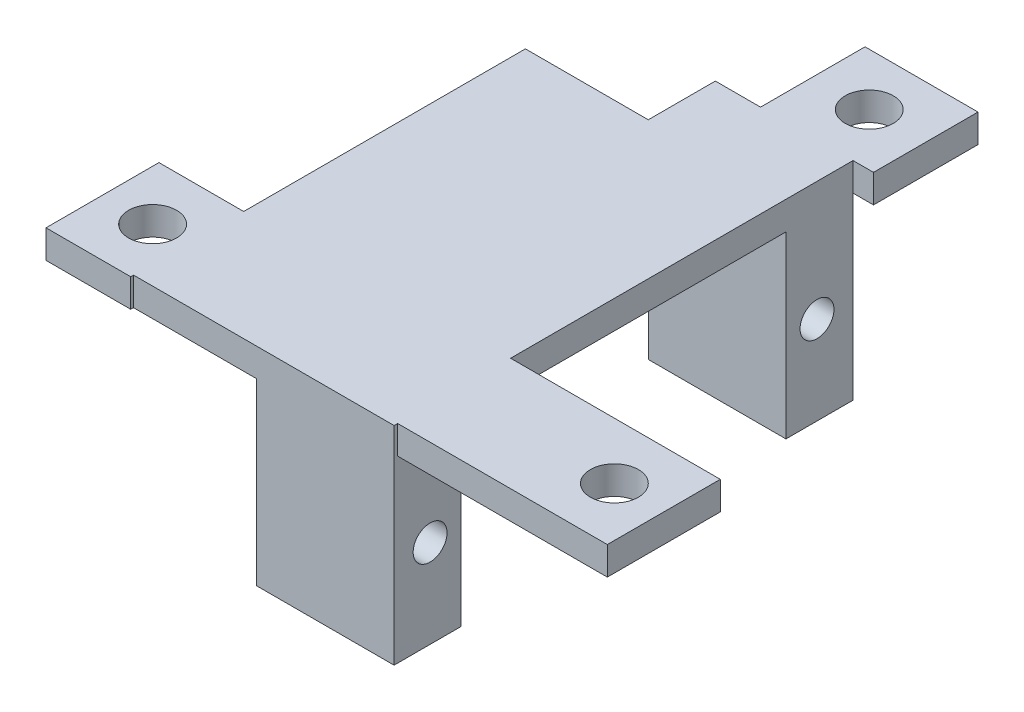
ISO-10303-21;
HEADER;
FILE_DESCRIPTION(('STEP AP214'),'2;1');
FILE_NAME('part.step','',(''),(''),'','','');
FILE_SCHEMA(('AUTOMOTIVE_DESIGN { 1 0 10303 214 1 1 1 1 }'));
ENDSEC;
DATA;
#1=APPLICATION_CONTEXT('core data for automotive mechanical design processes');
#2=APPLICATION_PROTOCOL_DEFINITION('international standard','automotive_design',2000,#1);
#3=PRODUCT_CONTEXT('',#1,'mechanical');
#4=PRODUCT('Part','Part','',(#3));
#5=PRODUCT_RELATED_PRODUCT_CATEGORY('part','',(#4));
#6=PRODUCT_DEFINITION_FORMATION('','',#4);
#7=PRODUCT_DEFINITION_CONTEXT('part definition',#1,'design');
#8=PRODUCT_DEFINITION('design','',#6,#7);
#9=PRODUCT_DEFINITION_SHAPE('','',#8);
#10=(LENGTH_UNIT() NAMED_UNIT(*) SI_UNIT(.MILLI.,.METRE.));
#11=(NAMED_UNIT(*) PLANE_ANGLE_UNIT() SI_UNIT($,.RADIAN.));
#12=(NAMED_UNIT(*) SI_UNIT($,.STERADIAN.) SOLID_ANGLE_UNIT());
#13=UNCERTAINTY_MEASURE_WITH_UNIT(LENGTH_MEASURE(1.E-05),#10,'distance_accuracy_value','');
#14=(GEOMETRIC_REPRESENTATION_CONTEXT(3) GLOBAL_UNCERTAINTY_ASSIGNED_CONTEXT((#13)) GLOBAL_UNIT_ASSIGNED_CONTEXT((#10,
#11,#12)) REPRESENTATION_CONTEXT('',''));
#15=CARTESIAN_POINT('',(0.,0.,0.));
#16=DIRECTION('',(0.,0.,1.));
#17=DIRECTION('',(1.,0.,0.));
#18=AXIS2_PLACEMENT_3D('',#15,#16,#17);
#19=CARTESIAN_POINT('',(0.,0.,0.));
#20=DIRECTION('',(0.,1.,0.));
#21=DIRECTION('',(0.,0.,1.));
#22=AXIS2_PLACEMENT_3D('',#19,#20,#21);
#23=PLANE('',#22);
#24=CARTESIAN_POINT('',(12.3,0.,12.));
#25=DIRECTION('',(0.,1.,0.));
#26=DIRECTION('',(0.,0.,1.));
#27=AXIS2_PLACEMENT_3D('',#24,#25,#26);
#28=CIRCLE('',#27,1.7);
#29=CARTESIAN_POINT('',(12.3,0.,13.7));
#30=VERTEX_POINT('',#29);
#31=EDGE_CURVE('E295',#30,#30,#28,.T.);
#32=ORIENTED_EDGE('',*,*,#31,.T.);
#33=EDGE_LOOP('',(#32));
#34=FACE_BOUND('',#33,.T.);
#35=CARTESIAN_POINT('',(-19.95,0.,12.45));
#36=DIRECTION('',(0.,1.,0.));
#37=DIRECTION('',(0.,0.,1.));
#38=AXIS2_PLACEMENT_3D('',#35,#36,#37);
#39=CIRCLE('',#38,1.7);
#40=CARTESIAN_POINT('',(-19.95,0.,14.15));
#41=VERTEX_POINT('',#40);
#42=EDGE_CURVE('E853',#41,#41,#39,.T.);
#43=ORIENTED_EDGE('',*,*,#42,.T.);
#44=EDGE_LOOP('',(#43));
#45=FACE_BOUND('',#44,.T.);
#46=DIRECTION('',(0.,0.,-1.));
#47=VECTOR('',#46,1.);
#48=CARTESIAN_POINT('',(-8.8,0.,0.));
#49=LINE('',#48,#47);
#50=CARTESIAN_POINT('',(-8.8,0.,16.25));
#51=VERTEX_POINT('',#50);
#52=CARTESIAN_POINT('',(-8.8,0.,11.5));
#53=VERTEX_POINT('',#52);
#54=EDGE_CURVE('E280',#51,#53,#49,.T.);
#55=ORIENTED_EDGE('',*,*,#54,.F.);
#56=DIRECTION('',(1.,0.,0.));
#57=VECTOR('',#56,1.);
#58=CARTESIAN_POINT('',(0.,0.,16.25));
#59=LINE('',#58,#57);
#60=CARTESIAN_POINT('',(-17.5,0.,16.25));
#61=VERTEX_POINT('',#60);
#62=EDGE_CURVE('E195',#61,#51,#59,.T.);
#63=ORIENTED_EDGE('',*,*,#62,.F.);
#64=DIRECTION('',(0.,0.,-1.));
#65=VECTOR('',#64,1.);
#66=CARTESIAN_POINT('',(-17.5,0.,0.));
#67=LINE('',#66,#65);
#68=CARTESIAN_POINT('',(-17.5,0.,16.45));
#69=VERTEX_POINT('',#68);
#70=EDGE_CURVE('E192',#69,#61,#67,.T.);
#71=ORIENTED_EDGE('',*,*,#70,.F.);
#72=DIRECTION('',(-1.,0.,0.));
#73=VECTOR('',#72,1.);
#74=CARTESIAN_POINT('',(0.,0.,16.45));
#75=LINE('',#74,#73);
#76=CARTESIAN_POINT('',(-23.5,0.,16.45));
#77=VERTEX_POINT('',#76);
#78=EDGE_CURVE('E190',#69,#77,#75,.T.);
#79=ORIENTED_EDGE('',*,*,#78,.T.);
#80=DIRECTION('',(0.,0.,-1.));
#81=VECTOR('',#80,1.);
#82=CARTESIAN_POINT('',(-23.5,0.,0.));
#83=LINE('',#82,#81);
#84=CARTESIAN_POINT('',(-23.5,0.,8.45));
#85=VERTEX_POINT('',#84);
#86=EDGE_CURVE('E227',#77,#85,#83,.T.);
#87=ORIENTED_EDGE('',*,*,#86,.T.);
#88=DIRECTION('',(1.,0.,0.));
#89=VECTOR('',#88,1.);
#90=CARTESIAN_POINT('',(0.,0.,8.45));
#91=LINE('',#90,#89);
#92=CARTESIAN_POINT('',(-17.5,0.,8.45));
#93=VERTEX_POINT('',#92);
#94=EDGE_CURVE('E225',#85,#93,#91,.T.);
#95=ORIENTED_EDGE('',*,*,#94,.T.);
#96=DIRECTION('',(0.,0.,-1.));
#97=VECTOR('',#96,1.);
#98=CARTESIAN_POINT('',(-17.5,0.,0.));
#99=LINE('',#98,#97);
#100=CARTESIAN_POINT('',(-17.5,0.,-11.5));
#101=VERTEX_POINT('',#100);
#102=EDGE_CURVE('E166',#93,#101,#99,.T.);
#103=ORIENTED_EDGE('',*,*,#102,.T.);
#104=DIRECTION('',(-1.,0.,0.));
#105=VECTOR('',#104,1.);
#106=CARTESIAN_POINT('',(0.,0.,-11.5));
#107=LINE('',#106,#105);
#108=CARTESIAN_POINT('',(-8.8,0.,-11.5));
#109=VERTEX_POINT('',#108);
#110=EDGE_CURVE('E221',#109,#101,#107,.T.);
#111=ORIENTED_EDGE('',*,*,#110,.F.);
#112=DIRECTION('',(1.,0.,0.));
#113=VECTOR('',#112,1.);
#114=CARTESIAN_POINT('',(0.,0.,-11.5));
#115=LINE('',#114,#113);
#116=CARTESIAN_POINT('',(0.950000000000003,0.,-11.5));
#117=VERTEX_POINT('',#116);
#118=EDGE_CURVE('E315',#109,#117,#115,.T.);
#119=ORIENTED_EDGE('',*,*,#118,.T.);
#120=DIRECTION('',(0.,0.,1.));
#121=VECTOR('',#120,1.);
#122=CARTESIAN_POINT('',(0.950000000000003,0.,0.));
#123=LINE('',#122,#121);
#124=CARTESIAN_POINT('',(0.950000000000003,0.,8.));
#125=VERTEX_POINT('',#124);
#126=EDGE_CURVE('E207',#117,#125,#123,.T.);
#127=ORIENTED_EDGE('',*,*,#126,.T.);
#128=DIRECTION('',(1.,0.,0.));
#129=VECTOR('',#128,1.);
#130=CARTESIAN_POINT('',(0.,0.,8.));
#131=LINE('',#130,#129);
#132=CARTESIAN_POINT('',(15.8,0.,8.));
#133=VERTEX_POINT('',#132);
#134=EDGE_CURVE('E204',#125,#133,#131,.T.);
#135=ORIENTED_EDGE('',*,*,#134,.T.);
#136=DIRECTION('',(0.,0.,1.));
#137=VECTOR('',#136,1.);
#138=CARTESIAN_POINT('',(15.8,0.,0.));
#139=LINE('',#138,#137);
#140=CARTESIAN_POINT('',(15.8,0.,16.));
#141=VERTEX_POINT('',#140);
#142=EDGE_CURVE('E201',#133,#141,#139,.T.);
#143=ORIENTED_EDGE('',*,*,#142,.T.);
#144=DIRECTION('',(-1.,0.,0.));
#145=VECTOR('',#144,1.);
#146=CARTESIAN_POINT('',(0.,0.,16.));
#147=LINE('',#146,#145);
#148=CARTESIAN_POINT('',(0.950000000000003,0.,16.));
#149=VERTEX_POINT('',#148);
#150=EDGE_CURVE('E198',#141,#149,#147,.T.);
#151=ORIENTED_EDGE('',*,*,#150,.T.);
#152=DIRECTION('',(0.,0.,1.));
#153=VECTOR('',#152,1.);
#154=CARTESIAN_POINT('',(0.950000000000001,0.,0.));
#155=LINE('',#154,#153);
#156=CARTESIAN_POINT('',(0.950000000000003,0.,11.5));
#157=VERTEX_POINT('',#156);
#158=EDGE_CURVE('E292',#157,#149,#155,.T.);
#159=ORIENTED_EDGE('',*,*,#158,.F.);
#160=DIRECTION('',(1.,0.,0.));
#161=VECTOR('',#160,1.);
#162=CARTESIAN_POINT('',(0.,0.,11.5));
#163=LINE('',#162,#161);
#164=EDGE_CURVE('E284',#53,#157,#163,.T.);
#165=ORIENTED_EDGE('',*,*,#164,.F.);
#166=EDGE_LOOP('',(#55,#63,#71,#79,#87,#95,#103,#111,#119,#127,#135,#143,#151,#159,#165));
#167=FACE_BOUND('',#166,.T.);
#168=ADVANCED_FACE('F39',(#34,#45,#167),#23,.F.);
#169=CARTESIAN_POINT('',(-1.6,0.,-19.95));
#170=DIRECTION('',(0.,1.,0.));
#171=DIRECTION('',(0.,0.,1.));
#172=AXIS2_PLACEMENT_3D('',#169,#170,#171);
#173=CIRCLE('',#172,1.7);
#174=CARTESIAN_POINT('',(-1.6,0.,-18.25));
#175=VERTEX_POINT('',#174);
#176=EDGE_CURVE('E290',#175,#175,#173,.T.);
#177=ORIENTED_EDGE('',*,*,#176,.T.);
#178=EDGE_LOOP('',(#177));
#179=FACE_BOUND('',#178,.T.);
#180=DIRECTION('',(1.,0.,0.));
#181=VECTOR('',#180,1.);
#182=CARTESIAN_POINT('',(0.,0.,-16.25));
#183=LINE('',#182,#181);
#184=CARTESIAN_POINT('',(0.949999999999999,0.,-16.25));
#185=VERTEX_POINT('',#184);
#186=CARTESIAN_POINT('',(2.4,0.,-16.25));
#187=VERTEX_POINT('',#186);
#188=EDGE_CURVE('E209',#185,#187,#183,.T.);
#189=ORIENTED_EDGE('',*,*,#188,.F.);
#190=DIRECTION('',(-1.,0.,0.));
#191=VECTOR('',#190,1.);
#192=CARTESIAN_POINT('',(0.,0.,-16.25));
#193=LINE('',#192,#191);
#194=CARTESIAN_POINT('',(-5.6,0.,-16.25));
#195=VERTEX_POINT('',#194);
#196=EDGE_CURVE('E310',#185,#195,#193,.T.);
#197=ORIENTED_EDGE('',*,*,#196,.T.);
#198=DIRECTION('',(0.,0.,-1.));
#199=VECTOR('',#198,1.);
#200=CARTESIAN_POINT('',(-5.6,0.,0.));
#201=LINE('',#200,#199);
#202=CARTESIAN_POINT('',(-5.6,0.,-23.65));
#203=VERTEX_POINT('',#202);
#204=EDGE_CURVE('E218',#195,#203,#201,.T.);
#205=ORIENTED_EDGE('',*,*,#204,.T.);
#206=DIRECTION('',(1.,0.,0.));
#207=VECTOR('',#206,1.);
#208=CARTESIAN_POINT('',(0.,0.,-23.65));
#209=LINE('',#208,#207);
#210=CARTESIAN_POINT('',(2.4,0.,-23.65));
#211=VERTEX_POINT('',#210);
#212=EDGE_CURVE('E215',#203,#211,#209,.T.);
#213=ORIENTED_EDGE('',*,*,#212,.T.);
#214=DIRECTION('',(0.,0.,1.));
#215=VECTOR('',#214,1.);
#216=CARTESIAN_POINT('',(2.4,0.,0.));
#217=LINE('',#216,#215);
#218=EDGE_CURVE('E212',#211,#187,#217,.T.);
#219=ORIENTED_EDGE('',*,*,#218,.T.);
#220=EDGE_LOOP('',(#189,#197,#205,#213,#219));
#221=FACE_BOUND('',#220,.T.);
#222=ADVANCED_FACE('F380',(#179,#221),#23,.F.);
#223=CARTESIAN_POINT('',(0.,2.,16.45));
#224=DIRECTION('',(0.,0.,1.));
#225=DIRECTION('',(1.,0.,0.));
#226=AXIS2_PLACEMENT_3D('',#223,#224,#225);
#227=PLANE('',#226);
#228=ORIENTED_EDGE('',*,*,#78,.F.);
#229=DIRECTION('',(0.,-1.,0.));
#230=VECTOR('',#229,1.);
#231=CARTESIAN_POINT('',(-17.5,2.,16.45));
#232=LINE('',#231,#230);
#233=CARTESIAN_POINT('',(-17.5,2.,16.45));
#234=VERTEX_POINT('',#233);
#235=EDGE_CURVE('E11',#234,#69,#232,.T.);
#236=ORIENTED_EDGE('',*,*,#235,.F.);
#237=DIRECTION('',(-1.,0.,0.));
#238=VECTOR('',#237,1.);
#239=CARTESIAN_POINT('',(0.,2.,16.45));
#240=LINE('',#239,#238);
#241=CARTESIAN_POINT('',(-23.5,2.,16.45));
#242=VERTEX_POINT('',#241);
#243=EDGE_CURVE('E230',#234,#242,#240,.T.);
#244=ORIENTED_EDGE('',*,*,#243,.T.);
#245=DIRECTION('',(0.,-1.,0.));
#246=VECTOR('',#245,1.);
#247=CARTESIAN_POINT('',(-23.5,2.,16.45));
#248=LINE('',#247,#246);
#249=EDGE_CURVE('E63',#242,#77,#248,.T.);
#250=ORIENTED_EDGE('',*,*,#249,.T.);
#251=EDGE_LOOP('',(#228,#236,#244,#250));
#252=FACE_BOUND('',#251,.T.);
#253=ADVANCED_FACE('F41',(#252),#227,.T.);
#254=CARTESIAN_POINT('',(-17.5,2.,0.));
#255=DIRECTION('',(-1.,0.,0.));
#256=DIRECTION('',(0.,0.,1.));
#257=AXIS2_PLACEMENT_3D('',#254,#255,#256);
#258=PLANE('',#257);
#259=ORIENTED_EDGE('',*,*,#70,.T.);
#260=DIRECTION('',(0.,-1.,0.));
#261=VECTOR('',#260,1.);
#262=CARTESIAN_POINT('',(-17.5,2.,16.25));
#263=LINE('',#262,#261);
#264=CARTESIAN_POINT('',(-17.5,2.,16.25));
#265=VERTEX_POINT('',#264);
#266=EDGE_CURVE('E47',#265,#61,#263,.T.);
#267=ORIENTED_EDGE('',*,*,#266,.F.);
#268=DIRECTION('',(0.,0.,-1.));
#269=VECTOR('',#268,1.);
#270=CARTESIAN_POINT('',(-17.5,2.,0.));
#271=LINE('',#270,#269);
#272=EDGE_CURVE('E333',#234,#265,#271,.T.);
#273=ORIENTED_EDGE('',*,*,#272,.F.);
#274=ORIENTED_EDGE('',*,*,#235,.T.);
#275=EDGE_LOOP('',(#259,#267,#273,#274));
#276=FACE_BOUND('',#275,.T.);
#277=ADVANCED_FACE('F379',(#276),#258,.F.);
#278=CARTESIAN_POINT('',(0.,2.,16.25));
#279=DIRECTION('',(0.,0.,-1.));
#280=DIRECTION('',(-1.,0.,0.));
#281=AXIS2_PLACEMENT_3D('',#278,#279,#280);
#282=PLANE('',#281);
#283=ORIENTED_EDGE('',*,*,#62,.T.);
#284=DIRECTION('',(0.,1.,0.));
#285=VECTOR('',#284,1.);
#286=CARTESIAN_POINT('',(-8.8,-12.7,16.25));
#287=LINE('',#286,#285);
#288=CARTESIAN_POINT('',(-8.8,-12.7,16.25));
#289=VERTEX_POINT('',#288);
#290=EDGE_CURVE('E308',#289,#51,#287,.T.);
#291=ORIENTED_EDGE('',*,*,#290,.F.);
#292=DIRECTION('',(-1.,0.,0.));
#293=VECTOR('',#292,1.);
#294=CARTESIAN_POINT('',(0.,-12.7,16.25));
#295=LINE('',#294,#293);
#296=CARTESIAN_POINT('',(0.950000000000003,-12.7,16.25));
#297=VERTEX_POINT('',#296);
#298=EDGE_CURVE('E302',#297,#289,#295,.T.);
#299=ORIENTED_EDGE('',*,*,#298,.F.);
#300=DIRECTION('',(0.,-1.,0.));
#301=VECTOR('',#300,1.);
#302=CARTESIAN_POINT('',(0.950000000000003,2.,16.25));
#303=LINE('',#302,#301);
#304=CARTESIAN_POINT('',(0.950000000000003,2.,16.25));
#305=VERTEX_POINT('',#304);
#306=EDGE_CURVE('E262',#305,#297,#303,.T.);
#307=ORIENTED_EDGE('',*,*,#306,.F.);
#308=DIRECTION('',(1.,0.,0.));
#309=VECTOR('',#308,1.);
#310=CARTESIAN_POINT('',(0.,2.,16.25));
#311=LINE('',#310,#309);
#312=EDGE_CURVE('E273',#265,#305,#311,.T.);
#313=ORIENTED_EDGE('',*,*,#312,.F.);
#314=ORIENTED_EDGE('',*,*,#266,.T.);
#315=EDGE_LOOP('',(#283,#291,#299,#307,#313,#314));
#316=FACE_BOUND('',#315,.T.);
#317=ADVANCED_FACE('F269',(#316),#282,.F.);
#318=CARTESIAN_POINT('',(0.950000000000001,2.,0.));
#319=DIRECTION('',(-1.,0.,0.));
#320=DIRECTION('',(0.,0.,1.));
#321=AXIS2_PLACEMENT_3D('',#318,#319,#320);
#322=PLANE('',#321);
#323=CARTESIAN_POINT('',(0.950000000000003,-6.45,13.7));
#324=DIRECTION('',(-1.,0.,0.));
#325=DIRECTION('',(0.,0.,1.));
#326=AXIS2_PLACEMENT_3D('',#323,#324,#325);
#327=CIRCLE('',#326,1.2);
#328=CARTESIAN_POINT('',(0.950000000000003,-6.45,14.9));
#329=VERTEX_POINT('',#328);
#330=EDGE_CURVE('E836',#329,#329,#327,.T.);
#331=ORIENTED_EDGE('',*,*,#330,.T.);
#332=EDGE_LOOP('',(#331));
#333=FACE_BOUND('',#332,.T.);
#334=ORIENTED_EDGE('',*,*,#306,.T.);
#335=DIRECTION('',(0.,0.,1.));
#336=VECTOR('',#335,1.);
#337=CARTESIAN_POINT('',(0.950000000000001,-12.7,0.));
#338=LINE('',#337,#336);
#339=CARTESIAN_POINT('',(0.950000000000003,-12.7,11.5));
#340=VERTEX_POINT('',#339);
#341=EDGE_CURVE('E298',#340,#297,#338,.T.);
#342=ORIENTED_EDGE('',*,*,#341,.F.);
#343=DIRECTION('',(0.,1.,0.));
#344=VECTOR('',#343,1.);
#345=CARTESIAN_POINT('',(0.950000000000003,-12.7,11.5));
#346=LINE('',#345,#344);
#347=EDGE_CURVE('E303',#340,#157,#346,.T.);
#348=ORIENTED_EDGE('',*,*,#347,.T.);
#349=ORIENTED_EDGE('',*,*,#158,.T.);
#350=DIRECTION('',(0.,-1.,0.));
#351=VECTOR('',#350,1.);
#352=CARTESIAN_POINT('',(0.950000000000003,2.,16.));
#353=LINE('',#352,#351);
#354=CARTESIAN_POINT('',(0.950000000000003,2.,16.));
#355=VERTEX_POINT('',#354);
#356=EDGE_CURVE('E259',#355,#149,#353,.T.);
#357=ORIENTED_EDGE('',*,*,#356,.F.);
#358=DIRECTION('',(0.,0.,-1.));
#359=VECTOR('',#358,1.);
#360=CARTESIAN_POINT('',(0.950000000000001,2.,0.));
#361=LINE('',#360,#359);
#362=EDGE_CURVE('E336',#305,#355,#361,.T.);
#363=ORIENTED_EDGE('',*,*,#362,.F.);
#364=EDGE_LOOP('',(#334,#342,#348,#349,#357,#363));
#365=FACE_BOUND('',#364,.T.);
#366=ADVANCED_FACE('F441',(#333,#365),#322,.F.);
#367=CARTESIAN_POINT('',(0.,2.,16.));
#368=DIRECTION('',(0.,0.,1.));
#369=DIRECTION('',(1.,0.,0.));
#370=AXIS2_PLACEMENT_3D('',#367,#368,#369);
#371=PLANE('',#370);
#372=ORIENTED_EDGE('',*,*,#150,.F.);
#373=DIRECTION('',(0.,-1.,0.));
#374=VECTOR('',#373,1.);
#375=CARTESIAN_POINT('',(15.8,2.,16.));
#376=LINE('',#375,#374);
#377=CARTESIAN_POINT('',(15.8,2.,16.));
#378=VERTEX_POINT('',#377);
#379=EDGE_CURVE('E257',#378,#141,#376,.T.);
#380=ORIENTED_EDGE('',*,*,#379,.F.);
#381=DIRECTION('',(-1.,0.,0.));
#382=VECTOR('',#381,1.);
#383=CARTESIAN_POINT('',(0.,2.,16.));
#384=LINE('',#383,#382);
#385=EDGE_CURVE('E338',#378,#355,#384,.T.);
#386=ORIENTED_EDGE('',*,*,#385,.T.);
#387=ORIENTED_EDGE('',*,*,#356,.T.);
#388=EDGE_LOOP('',(#372,#380,#386,#387));
#389=FACE_BOUND('',#388,.T.);
#390=ADVANCED_FACE('F437',(#389),#371,.T.);
#391=CARTESIAN_POINT('',(15.8,2.,0.));
#392=DIRECTION('',(1.,0.,0.));
#393=DIRECTION('',(0.,0.,-1.));
#394=AXIS2_PLACEMENT_3D('',#391,#392,#393);
#395=PLANE('',#394);
#396=ORIENTED_EDGE('',*,*,#142,.F.);
#397=DIRECTION('',(0.,-1.,0.));
#398=VECTOR('',#397,1.);
#399=CARTESIAN_POINT('',(15.8,2.,8.));
#400=LINE('',#399,#398);
#401=CARTESIAN_POINT('',(15.8,2.,8.));
#402=VERTEX_POINT('',#401);
#403=EDGE_CURVE('E255',#402,#133,#400,.T.);
#404=ORIENTED_EDGE('',*,*,#403,.F.);
#405=DIRECTION('',(0.,0.,1.));
#406=VECTOR('',#405,1.);
#407=CARTESIAN_POINT('',(15.8,2.,0.));
#408=LINE('',#407,#406);
#409=EDGE_CURVE('E341',#402,#378,#408,.T.);
#410=ORIENTED_EDGE('',*,*,#409,.T.);
#411=ORIENTED_EDGE('',*,*,#379,.T.);
#412=EDGE_LOOP('',(#396,#404,#410,#411));
#413=FACE_BOUND('',#412,.T.);
#414=ADVANCED_FACE('F433',(#413),#395,.T.);
#415=CARTESIAN_POINT('',(0.,2.,8.));
#416=DIRECTION('',(0.,0.,-1.));
#417=DIRECTION('',(-1.,0.,0.));
#418=AXIS2_PLACEMENT_3D('',#415,#416,#417);
#419=PLANE('',#418);
#420=ORIENTED_EDGE('',*,*,#134,.F.);
#421=DIRECTION('',(0.,-1.,0.));
#422=VECTOR('',#421,1.);
#423=CARTESIAN_POINT('',(0.950000000000003,2.,8.));
#424=LINE('',#423,#422);
#425=CARTESIAN_POINT('',(0.950000000000003,2.,8.));
#426=VERTEX_POINT('',#425);
#427=EDGE_CURVE('E252',#426,#125,#424,.T.);
#428=ORIENTED_EDGE('',*,*,#427,.F.);
#429=DIRECTION('',(1.,0.,0.));
#430=VECTOR('',#429,1.);
#431=CARTESIAN_POINT('',(0.,2.,8.));
#432=LINE('',#431,#430);
#433=EDGE_CURVE('E344',#426,#402,#432,.T.);
#434=ORIENTED_EDGE('',*,*,#433,.T.);
#435=ORIENTED_EDGE('',*,*,#403,.T.);
#436=EDGE_LOOP('',(#420,#428,#434,#435));
#437=FACE_BOUND('',#436,.T.);
#438=ADVANCED_FACE('F429',(#437),#419,.T.);
#439=CARTESIAN_POINT('',(0.950000000000003,2.,0.));
#440=DIRECTION('',(1.,0.,0.));
#441=DIRECTION('',(0.,0.,-1.));
#442=AXIS2_PLACEMENT_3D('',#439,#440,#441);
#443=PLANE('',#442);
#444=CARTESIAN_POINT('',(0.95,-6.45,-13.7));
#445=DIRECTION('',(-1.,0.,0.));
#446=DIRECTION('',(0.,0.,1.));
#447=AXIS2_PLACEMENT_3D('',#444,#445,#446);
#448=CIRCLE('',#447,1.2);
#449=CARTESIAN_POINT('',(0.95,-6.45,-12.5));
#450=VERTEX_POINT('',#449);
#451=EDGE_CURVE('E842',#450,#450,#448,.T.);
#452=ORIENTED_EDGE('',*,*,#451,.T.);
#453=EDGE_LOOP('',(#452));
#454=FACE_BOUND('',#453,.T.);
#455=ORIENTED_EDGE('',*,*,#126,.F.);
#456=DIRECTION('',(0.,1.,0.));
#457=VECTOR('',#456,1.);
#458=CARTESIAN_POINT('',(0.950000000000003,-12.7,-11.5));
#459=LINE('',#458,#457);
#460=CARTESIAN_POINT('',(0.950000000000003,-12.7,-11.5));
#461=VERTEX_POINT('',#460);
#462=EDGE_CURVE('E54',#461,#117,#459,.T.);
#463=ORIENTED_EDGE('',*,*,#462,.F.);
#464=DIRECTION('',(0.,0.,-1.));
#465=VECTOR('',#464,1.);
#466=CARTESIAN_POINT('',(0.950000000000011,-12.7,0.));
#467=LINE('',#466,#465);
#468=CARTESIAN_POINT('',(0.949999999999999,-12.7,-16.25));
#469=VERTEX_POINT('',#468);
#470=EDGE_CURVE('E320',#461,#469,#467,.T.);
#471=ORIENTED_EDGE('',*,*,#470,.T.);
#472=DIRECTION('',(0.,1.,0.));
#473=VECTOR('',#472,1.);
#474=CARTESIAN_POINT('',(0.949999999999999,-12.7,-16.25));
#475=LINE('',#474,#473);
#476=EDGE_CURVE('E193',#469,#185,#475,.T.);
#477=ORIENTED_EDGE('',*,*,#476,.T.);
#478=DIRECTION('',(0.,-1.,0.));
#479=VECTOR('',#478,1.);
#480=CARTESIAN_POINT('',(0.949999999999999,2.,-16.25));
#481=LINE('',#480,#479);
#482=CARTESIAN_POINT('',(0.949999999999999,2.,-16.25));
#483=VERTEX_POINT('',#482);
#484=EDGE_CURVE('E249',#483,#185,#481,.T.);
#485=ORIENTED_EDGE('',*,*,#484,.F.);
#486=DIRECTION('',(0.,0.,1.));
#487=VECTOR('',#486,1.);
#488=CARTESIAN_POINT('',(0.950000000000003,2.,0.));
#489=LINE('',#488,#487);
#490=EDGE_CURVE('E347',#483,#426,#489,.T.);
#491=ORIENTED_EDGE('',*,*,#490,.T.);
#492=ORIENTED_EDGE('',*,*,#427,.T.);
#493=EDGE_LOOP('',(#455,#463,#471,#477,#485,#491,#492));
#494=FACE_BOUND('',#493,.T.);
#495=ADVANCED_FACE('F425',(#454,#494),#443,.T.);
#496=CARTESIAN_POINT('',(0.,2.,-16.25));
#497=DIRECTION('',(0.,0.,-1.));
#498=DIRECTION('',(-1.,0.,0.));
#499=AXIS2_PLACEMENT_3D('',#496,#497,#498);
#500=PLANE('',#499);
#501=ORIENTED_EDGE('',*,*,#188,.T.);
#502=DIRECTION('',(0.,-1.,0.));
#503=VECTOR('',#502,1.);
#504=CARTESIAN_POINT('',(2.4,2.,-16.25));
#505=LINE('',#504,#503);
#506=CARTESIAN_POINT('',(2.4,2.,-16.25));
#507=VERTEX_POINT('',#506);
#508=EDGE_CURVE('E247',#507,#187,#505,.T.);
#509=ORIENTED_EDGE('',*,*,#508,.F.);
#510=DIRECTION('',(1.,0.,0.));
#511=VECTOR('',#510,1.);
#512=CARTESIAN_POINT('',(0.,2.,-16.25));
#513=LINE('',#512,#511);
#514=EDGE_CURVE('E350',#483,#507,#513,.T.);
#515=ORIENTED_EDGE('',*,*,#514,.F.);
#516=ORIENTED_EDGE('',*,*,#484,.T.);
#517=EDGE_LOOP('',(#501,#509,#515,#516));
#518=FACE_BOUND('',#517,.T.);
#519=ADVANCED_FACE('F421',(#518),#500,.F.);
#520=CARTESIAN_POINT('',(2.4,2.,0.));
#521=DIRECTION('',(1.,0.,0.));
#522=DIRECTION('',(0.,0.,-1.));
#523=AXIS2_PLACEMENT_3D('',#520,#521,#522);
#524=PLANE('',#523);
#525=ORIENTED_EDGE('',*,*,#218,.F.);
#526=DIRECTION('',(0.,-1.,0.));
#527=VECTOR('',#526,1.);
#528=CARTESIAN_POINT('',(2.4,2.,-23.65));
#529=LINE('',#528,#527);
#530=CARTESIAN_POINT('',(2.4,2.,-23.65));
#531=VERTEX_POINT('',#530);
#532=EDGE_CURVE('E245',#531,#211,#529,.T.);
#533=ORIENTED_EDGE('',*,*,#532,.F.);
#534=DIRECTION('',(0.,0.,1.));
#535=VECTOR('',#534,1.);
#536=CARTESIAN_POINT('',(2.4,2.,0.));
#537=LINE('',#536,#535);
#538=EDGE_CURVE('E352',#531,#507,#537,.T.);
#539=ORIENTED_EDGE('',*,*,#538,.T.);
#540=ORIENTED_EDGE('',*,*,#508,.T.);
#541=EDGE_LOOP('',(#525,#533,#539,#540));
#542=FACE_BOUND('',#541,.T.);
#543=ADVANCED_FACE('F417',(#542),#524,.T.);
#544=CARTESIAN_POINT('',(0.,2.,-23.65));
#545=DIRECTION('',(0.,0.,-1.));
#546=DIRECTION('',(-1.,0.,0.));
#547=AXIS2_PLACEMENT_3D('',#544,#545,#546);
#548=PLANE('',#547);
#549=ORIENTED_EDGE('',*,*,#212,.F.);
#550=DIRECTION('',(0.,-1.,0.));
#551=VECTOR('',#550,1.);
#552=CARTESIAN_POINT('',(-5.6,2.,-23.65));
#553=LINE('',#552,#551);
#554=CARTESIAN_POINT('',(-5.6,2.,-23.65));
#555=VERTEX_POINT('',#554);
#556=EDGE_CURVE('E243',#555,#203,#553,.T.);
#557=ORIENTED_EDGE('',*,*,#556,.F.);
#558=DIRECTION('',(1.,0.,0.));
#559=VECTOR('',#558,1.);
#560=CARTESIAN_POINT('',(0.,2.,-23.65));
#561=LINE('',#560,#559);
#562=EDGE_CURVE('E355',#555,#531,#561,.T.);
#563=ORIENTED_EDGE('',*,*,#562,.T.);
#564=ORIENTED_EDGE('',*,*,#532,.T.);
#565=EDGE_LOOP('',(#549,#557,#563,#564));
#566=FACE_BOUND('',#565,.T.);
#567=ADVANCED_FACE('F413',(#566),#548,.T.);
#568=CARTESIAN_POINT('',(-5.6,2.,0.));
#569=DIRECTION('',(-1.,0.,0.));
#570=DIRECTION('',(0.,0.,1.));
#571=AXIS2_PLACEMENT_3D('',#568,#569,#570);
#572=PLANE('',#571);
#573=ORIENTED_EDGE('',*,*,#204,.F.);
#574=DIRECTION('',(0.,-1.,0.));
#575=VECTOR('',#574,1.);
#576=CARTESIAN_POINT('',(-5.6,2.,-16.25));
#577=LINE('',#576,#575);
#578=CARTESIAN_POINT('',(-5.6,2.,-16.25));
#579=VERTEX_POINT('',#578);
#580=EDGE_CURVE('E240',#579,#195,#577,.T.);
#581=ORIENTED_EDGE('',*,*,#580,.F.);
#582=DIRECTION('',(0.,0.,-1.));
#583=VECTOR('',#582,1.);
#584=CARTESIAN_POINT('',(-5.6,2.,0.));
#585=LINE('',#584,#583);
#586=EDGE_CURVE('E358',#579,#555,#585,.T.);
#587=ORIENTED_EDGE('',*,*,#586,.T.);
#588=ORIENTED_EDGE('',*,*,#556,.T.);
#589=EDGE_LOOP('',(#573,#581,#587,#588));
#590=FACE_BOUND('',#589,.T.);
#591=ADVANCED_FACE('F409',(#590),#572,.T.);
#592=CARTESIAN_POINT('',(0.,2.,-16.25));
#593=DIRECTION('',(0.,0.,-1.));
#594=DIRECTION('',(-1.,0.,0.));
#595=AXIS2_PLACEMENT_3D('',#592,#593,#594);
#596=PLANE('',#595);
#597=ORIENTED_EDGE('',*,*,#580,.T.);
#598=ORIENTED_EDGE('',*,*,#196,.F.);
#599=ORIENTED_EDGE('',*,*,#476,.F.);
#600=DIRECTION('',(-1.,0.,0.));
#601=VECTOR('',#600,1.);
#602=CARTESIAN_POINT('',(0.,-12.7,-16.25));
#603=LINE('',#602,#601);
#604=CARTESIAN_POINT('',(-8.80000000000001,-12.7,-16.25));
#605=VERTEX_POINT('',#604);
#606=EDGE_CURVE('E311',#469,#605,#603,.T.);
#607=ORIENTED_EDGE('',*,*,#606,.T.);
#608=DIRECTION('',(0.,-1.,0.));
#609=VECTOR('',#608,1.);
#610=CARTESIAN_POINT('',(-8.8,2.,-16.25));
#611=LINE('',#610,#609);
#612=CARTESIAN_POINT('',(-8.8,2.,-16.25));
#613=VERTEX_POINT('',#612);
#614=EDGE_CURVE('E237',#613,#605,#611,.T.);
#615=ORIENTED_EDGE('',*,*,#614,.F.);
#616=DIRECTION('',(1.,0.,0.));
#617=VECTOR('',#616,1.);
#618=CARTESIAN_POINT('',(0.,2.,-16.25));
#619=LINE('',#618,#617);
#620=EDGE_CURVE('E361',#613,#579,#619,.T.);
#621=ORIENTED_EDGE('',*,*,#620,.T.);
#622=EDGE_LOOP('',(#597,#598,#599,#607,#615,#621));
#623=FACE_BOUND('',#622,.T.);
#624=ADVANCED_FACE('F406',(#623),#596,.T.);
#625=CARTESIAN_POINT('',(-8.79999999999999,2.,0.));
#626=DIRECTION('',(1.,0.,0.));
#627=DIRECTION('',(0.,0.,-1.));
#628=AXIS2_PLACEMENT_3D('',#625,#626,#627);
#629=PLANE('',#628);
#630=ORIENTED_EDGE('',*,*,#614,.T.);
#631=DIRECTION('',(0.,0.,-1.));
#632=VECTOR('',#631,1.);
#633=CARTESIAN_POINT('',(-8.79999999999999,-12.7,0.));
#634=LINE('',#633,#632);
#635=CARTESIAN_POINT('',(-8.8,-12.7,-11.5));
#636=VERTEX_POINT('',#635);
#637=EDGE_CURVE('E314',#636,#605,#634,.T.);
#638=ORIENTED_EDGE('',*,*,#637,.F.);
#639=DIRECTION('',(0.,1.,0.));
#640=VECTOR('',#639,1.);
#641=CARTESIAN_POINT('',(-8.8,-12.7,-11.5));
#642=LINE('',#641,#640);
#643=EDGE_CURVE('E323',#636,#109,#642,.T.);
#644=ORIENTED_EDGE('',*,*,#643,.T.);
#645=DIRECTION('',(0.,-1.,0.));
#646=VECTOR('',#645,1.);
#647=CARTESIAN_POINT('',(-8.8,2.,-11.5));
#648=LINE('',#647,#646);
#649=CARTESIAN_POINT('',(-8.8,2.,-11.5));
#650=VERTEX_POINT('',#649);
#651=EDGE_CURVE('E234',#650,#109,#648,.T.);
#652=ORIENTED_EDGE('',*,*,#651,.F.);
#653=DIRECTION('',(0.,0.,1.));
#654=VECTOR('',#653,1.);
#655=CARTESIAN_POINT('',(-8.79999999999999,2.,0.));
#656=LINE('',#655,#654);
#657=EDGE_CURVE('E364',#613,#650,#656,.T.);
#658=ORIENTED_EDGE('',*,*,#657,.F.);
#659=EDGE_LOOP('',(#630,#638,#644,#652,#658));
#660=FACE_BOUND('',#659,.T.);
#661=ADVANCED_FACE('F370',(#660),#629,.F.);
#662=CARTESIAN_POINT('',(0.,2.,-11.5));
#663=DIRECTION('',(0.,0.,1.));
#664=DIRECTION('',(1.,0.,0.));
#665=AXIS2_PLACEMENT_3D('',#662,#663,#664);
#666=PLANE('',#665);
#667=ORIENTED_EDGE('',*,*,#110,.T.);
#668=DIRECTION('',(0.,-1.,0.));
#669=VECTOR('',#668,1.);
#670=CARTESIAN_POINT('',(-17.5,2.,-11.5));
#671=LINE('',#670,#669);
#672=CARTESIAN_POINT('',(-17.5,2.,-11.5));
#673=VERTEX_POINT('',#672);
#674=EDGE_CURVE('E171',#673,#101,#671,.T.);
#675=ORIENTED_EDGE('',*,*,#674,.F.);
#676=DIRECTION('',(-1.,0.,0.));
#677=VECTOR('',#676,1.);
#678=CARTESIAN_POINT('',(0.,2.,-11.5));
#679=LINE('',#678,#677);
#680=EDGE_CURVE('E181',#650,#673,#679,.T.);
#681=ORIENTED_EDGE('',*,*,#680,.F.);
#682=ORIENTED_EDGE('',*,*,#651,.T.);
#683=EDGE_LOOP('',(#667,#675,#681,#682));
#684=FACE_BOUND('',#683,.T.);
#685=ADVANCED_FACE('F376',(#684),#666,.F.);
#686=CARTESIAN_POINT('',(-17.5,2.,0.));
#687=DIRECTION('',(-1.,0.,0.));
#688=DIRECTION('',(0.,0.,1.));
#689=AXIS2_PLACEMENT_3D('',#686,#687,#688);
#690=PLANE('',#689);
#691=ORIENTED_EDGE('',*,*,#102,.F.);
#692=DIRECTION('',(0.,-1.,0.));
#693=VECTOR('',#692,1.);
#694=CARTESIAN_POINT('',(-17.5,2.,8.45));
#695=LINE('',#694,#693);
#696=CARTESIAN_POINT('',(-17.5,2.,8.45));
#697=VERTEX_POINT('',#696);
#698=EDGE_CURVE('E161',#697,#93,#695,.T.);
#699=ORIENTED_EDGE('',*,*,#698,.F.);
#700=DIRECTION('',(0.,0.,-1.));
#701=VECTOR('',#700,1.);
#702=CARTESIAN_POINT('',(-17.5,2.,0.));
#703=LINE('',#702,#701);
#704=EDGE_CURVE('E164',#697,#673,#703,.T.);
#705=ORIENTED_EDGE('',*,*,#704,.T.);
#706=ORIENTED_EDGE('',*,*,#674,.T.);
#707=EDGE_LOOP('',(#691,#699,#705,#706));
#708=FACE_BOUND('',#707,.T.);
#709=ADVANCED_FACE('F163',(#708),#690,.T.);
#710=CARTESIAN_POINT('',(0.,2.,8.45));
#711=DIRECTION('',(0.,0.,-1.));
#712=DIRECTION('',(-1.,0.,0.));
#713=AXIS2_PLACEMENT_3D('',#710,#711,#712);
#714=PLANE('',#713);
#715=ORIENTED_EDGE('',*,*,#94,.F.);
#716=DIRECTION('',(0.,-1.,0.));
#717=VECTOR('',#716,1.);
#718=CARTESIAN_POINT('',(-23.5,2.,8.45));
#719=LINE('',#718,#717);
#720=CARTESIAN_POINT('',(-23.5,2.,8.45));
#721=VERTEX_POINT('',#720);
#722=EDGE_CURVE('E172',#721,#85,#719,.T.);
#723=ORIENTED_EDGE('',*,*,#722,.F.);
#724=DIRECTION('',(1.,0.,0.));
#725=VECTOR('',#724,1.);
#726=CARTESIAN_POINT('',(0.,2.,8.45));
#727=LINE('',#726,#725);
#728=EDGE_CURVE('E179',#721,#697,#727,.T.);
#729=ORIENTED_EDGE('',*,*,#728,.T.);
#730=ORIENTED_EDGE('',*,*,#698,.T.);
#731=EDGE_LOOP('',(#715,#723,#729,#730));
#732=FACE_BOUND('',#731,.T.);
#733=ADVANCED_FACE('F184',(#732),#714,.T.);
#734=CARTESIAN_POINT('',(-23.5,2.,0.));
#735=DIRECTION('',(-1.,0.,0.));
#736=DIRECTION('',(0.,0.,1.));
#737=AXIS2_PLACEMENT_3D('',#734,#735,#736);
#738=PLANE('',#737);
#739=ORIENTED_EDGE('',*,*,#86,.F.);
#740=ORIENTED_EDGE('',*,*,#249,.F.);
#741=DIRECTION('',(0.,0.,-1.));
#742=VECTOR('',#741,1.);
#743=CARTESIAN_POINT('',(-23.5,2.,0.));
#744=LINE('',#743,#742);
#745=EDGE_CURVE('E185',#242,#721,#744,.T.);
#746=ORIENTED_EDGE('',*,*,#745,.T.);
#747=ORIENTED_EDGE('',*,*,#722,.T.);
#748=EDGE_LOOP('',(#739,#740,#746,#747));
#749=FACE_BOUND('',#748,.T.);
#750=ADVANCED_FACE('F377',(#749),#738,.T.);
#751=CARTESIAN_POINT('',(0.,2.,0.));
#752=DIRECTION('',(0.,1.,0.));
#753=DIRECTION('',(0.,0.,1.));
#754=AXIS2_PLACEMENT_3D('',#751,#752,#753);
#755=PLANE('',#754);
#756=CARTESIAN_POINT('',(-1.6,2.,-19.95));
#757=DIRECTION('',(0.,1.,0.));
#758=DIRECTION('',(0.,0.,1.));
#759=AXIS2_PLACEMENT_3D('',#756,#757,#758);
#760=CIRCLE('',#759,1.7);
#761=CARTESIAN_POINT('',(-1.6,2.,-18.25));
#762=VERTEX_POINT('',#761);
#763=EDGE_CURVE('E850',#762,#762,#760,.T.);
#764=ORIENTED_EDGE('',*,*,#763,.F.);
#765=EDGE_LOOP('',(#764));
#766=FACE_BOUND('',#765,.T.);
#767=CARTESIAN_POINT('',(12.3,2.,12.));
#768=DIRECTION('',(0.,1.,0.));
#769=DIRECTION('',(0.,0.,1.));
#770=AXIS2_PLACEMENT_3D('',#767,#768,#769);
#771=CIRCLE('',#770,1.7);
#772=CARTESIAN_POINT('',(12.3,2.,13.7));
#773=VERTEX_POINT('',#772);
#774=EDGE_CURVE('E839',#773,#773,#771,.T.);
#775=ORIENTED_EDGE('',*,*,#774,.F.);
#776=EDGE_LOOP('',(#775));
#777=FACE_BOUND('',#776,.T.);
#778=CARTESIAN_POINT('',(-19.95,2.,12.45));
#779=DIRECTION('',(0.,1.,0.));
#780=DIRECTION('',(0.,0.,1.));
#781=AXIS2_PLACEMENT_3D('',#778,#779,#780);
#782=CIRCLE('',#781,1.7);
#783=CARTESIAN_POINT('',(-19.95,2.,14.15));
#784=VERTEX_POINT('',#783);
#785=EDGE_CURVE('E835',#784,#784,#782,.T.);
#786=ORIENTED_EDGE('',*,*,#785,.F.);
#787=EDGE_LOOP('',(#786));
#788=FACE_BOUND('',#787,.T.);
#789=ORIENTED_EDGE('',*,*,#243,.F.);
#790=ORIENTED_EDGE('',*,*,#272,.T.);
#791=ORIENTED_EDGE('',*,*,#312,.T.);
#792=ORIENTED_EDGE('',*,*,#362,.T.);
#793=ORIENTED_EDGE('',*,*,#385,.F.);
#794=ORIENTED_EDGE('',*,*,#409,.F.);
#795=ORIENTED_EDGE('',*,*,#433,.F.);
#796=ORIENTED_EDGE('',*,*,#490,.F.);
#797=ORIENTED_EDGE('',*,*,#514,.T.);
#798=ORIENTED_EDGE('',*,*,#538,.F.);
#799=ORIENTED_EDGE('',*,*,#562,.F.);
#800=ORIENTED_EDGE('',*,*,#586,.F.);
#801=ORIENTED_EDGE('',*,*,#620,.F.);
#802=ORIENTED_EDGE('',*,*,#657,.T.);
#803=ORIENTED_EDGE('',*,*,#680,.T.);
#804=ORIENTED_EDGE('',*,*,#704,.F.);
#805=ORIENTED_EDGE('',*,*,#728,.F.);
#806=ORIENTED_EDGE('',*,*,#745,.F.);
#807=EDGE_LOOP('',(#789,#790,#791,#792,#793,#794,#795,#796,#797,#798,#799,#800,#801,#802,#803,
#804,#805,#806));
#808=FACE_BOUND('',#807,.T.);
#809=ADVANCED_FACE('F177',(#766,#777,#788,#808),#755,.T.);
#810=CARTESIAN_POINT('',(0.,-12.7,-11.5));
#811=DIRECTION('',(0.,0.,1.));
#812=DIRECTION('',(1.,0.,0.));
#813=AXIS2_PLACEMENT_3D('',#810,#811,#812);
#814=PLANE('',#813);
#815=ORIENTED_EDGE('',*,*,#118,.F.);
#816=ORIENTED_EDGE('',*,*,#643,.F.);
#817=DIRECTION('',(1.,0.,0.));
#818=VECTOR('',#817,1.);
#819=CARTESIAN_POINT('',(0.,-12.7,-11.5));
#820=LINE('',#819,#818);
#821=EDGE_CURVE('E318',#636,#461,#820,.T.);
#822=ORIENTED_EDGE('',*,*,#821,.T.);
#823=ORIENTED_EDGE('',*,*,#462,.T.);
#824=EDGE_LOOP('',(#815,#816,#822,#823));
#825=FACE_BOUND('',#824,.T.);
#826=ADVANCED_FACE('F520',(#825),#814,.T.);
#827=CARTESIAN_POINT('',(0.,-12.7,0.));
#828=DIRECTION('',(0.,-1.,0.));
#829=DIRECTION('',(0.,0.,-1.));
#830=AXIS2_PLACEMENT_3D('',#827,#828,#829);
#831=PLANE('',#830);
#832=ORIENTED_EDGE('',*,*,#606,.F.);
#833=ORIENTED_EDGE('',*,*,#470,.F.);
#834=ORIENTED_EDGE('',*,*,#821,.F.);
#835=ORIENTED_EDGE('',*,*,#637,.T.);
#836=EDGE_LOOP('',(#832,#833,#834,#835));
#837=FACE_BOUND('',#836,.T.);
#838=ADVANCED_FACE('F528',(#837),#831,.T.);
#839=CARTESIAN_POINT('',(-8.8,-12.7,0.));
#840=DIRECTION('',(1.,0.,0.));
#841=DIRECTION('',(0.,0.,-1.));
#842=AXIS2_PLACEMENT_3D('',#839,#840,#841);
#843=PLANE('',#842);
#844=ORIENTED_EDGE('',*,*,#54,.T.);
#845=DIRECTION('',(0.,1.,0.));
#846=VECTOR('',#845,1.);
#847=CARTESIAN_POINT('',(-8.8,-12.7,11.5));
#848=LINE('',#847,#846);
#849=CARTESIAN_POINT('',(-8.8,-12.7,11.5));
#850=VERTEX_POINT('',#849);
#851=EDGE_CURVE('E306',#850,#53,#848,.T.);
#852=ORIENTED_EDGE('',*,*,#851,.F.);
#853=DIRECTION('',(0.,0.,-1.));
#854=VECTOR('',#853,1.);
#855=CARTESIAN_POINT('',(-8.8,-12.7,0.));
#856=LINE('',#855,#854);
#857=EDGE_CURVE('E861',#289,#850,#856,.T.);
#858=ORIENTED_EDGE('',*,*,#857,.F.);
#859=ORIENTED_EDGE('',*,*,#290,.T.);
#860=EDGE_LOOP('',(#844,#852,#858,#859));
#861=FACE_BOUND('',#860,.T.);
#862=ADVANCED_FACE('F534',(#861),#843,.F.);
#863=CARTESIAN_POINT('',(0.,-12.7,11.5));
#864=DIRECTION('',(0.,0.,1.));
#865=DIRECTION('',(1.,0.,0.));
#866=AXIS2_PLACEMENT_3D('',#863,#864,#865);
#867=PLANE('',#866);
#868=ORIENTED_EDGE('',*,*,#164,.T.);
#869=ORIENTED_EDGE('',*,*,#347,.F.);
#870=DIRECTION('',(1.,0.,0.));
#871=VECTOR('',#870,1.);
#872=CARTESIAN_POINT('',(0.,-12.7,11.5));
#873=LINE('',#872,#871);
#874=EDGE_CURVE('E863',#850,#340,#873,.T.);
#875=ORIENTED_EDGE('',*,*,#874,.F.);
#876=ORIENTED_EDGE('',*,*,#851,.T.);
#877=EDGE_LOOP('',(#868,#869,#875,#876));
#878=FACE_BOUND('',#877,.T.);
#879=ADVANCED_FACE('F542',(#878),#867,.F.);
#880=CARTESIAN_POINT('',(0.,-12.7,0.));
#881=DIRECTION('',(0.,-1.,0.));
#882=DIRECTION('',(0.,0.,-1.));
#883=AXIS2_PLACEMENT_3D('',#880,#881,#882);
#884=PLANE('',#883);
#885=ORIENTED_EDGE('',*,*,#298,.T.);
#886=ORIENTED_EDGE('',*,*,#857,.T.);
#887=ORIENTED_EDGE('',*,*,#874,.T.);
#888=ORIENTED_EDGE('',*,*,#341,.T.);
#889=EDGE_LOOP('',(#885,#886,#887,#888));
#890=FACE_BOUND('',#889,.T.);
#891=ADVANCED_FACE('F549',(#890),#884,.T.);
#892=CARTESIAN_POINT('',(-19.95,-12.7,12.45));
#893=DIRECTION('',(0.,1.,0.));
#894=DIRECTION('',(0.,0.,1.));
#895=AXIS2_PLACEMENT_3D('',#892,#893,#894);
#896=CYLINDRICAL_SURFACE('',#895,1.7);
#897=ORIENTED_EDGE('',*,*,#785,.T.);
#898=EDGE_LOOP('',(#897));
#899=FACE_BOUND('',#898,.T.);
#900=ORIENTED_EDGE('',*,*,#42,.F.);
#901=EDGE_LOOP('',(#900));
#902=FACE_BOUND('',#901,.T.);
#903=ADVANCED_FACE('F557',(#899,#902),#896,.F.);
#904=CARTESIAN_POINT('',(12.3,-12.7,12.));
#905=DIRECTION('',(0.,1.,0.));
#906=DIRECTION('',(0.,0.,1.));
#907=AXIS2_PLACEMENT_3D('',#904,#905,#906);
#908=CYLINDRICAL_SURFACE('',#907,1.7);
#909=ORIENTED_EDGE('',*,*,#774,.T.);
#910=EDGE_LOOP('',(#909));
#911=FACE_BOUND('',#910,.T.);
#912=ORIENTED_EDGE('',*,*,#31,.F.);
#913=EDGE_LOOP('',(#912));
#914=FACE_BOUND('',#913,.T.);
#915=ADVANCED_FACE('F564',(#911,#914),#908,.F.);
#916=CARTESIAN_POINT('',(-1.6,-12.7,-19.95));
#917=DIRECTION('',(0.,1.,0.));
#918=DIRECTION('',(0.,0.,1.));
#919=AXIS2_PLACEMENT_3D('',#916,#917,#918);
#920=CYLINDRICAL_SURFACE('',#919,1.7);
#921=ORIENTED_EDGE('',*,*,#763,.T.);
#922=EDGE_LOOP('',(#921));
#923=FACE_BOUND('',#922,.T.);
#924=ORIENTED_EDGE('',*,*,#176,.F.);
#925=EDGE_LOOP('',(#924));
#926=FACE_BOUND('',#925,.T.);
#927=ADVANCED_FACE('F572',(#923,#926),#920,.F.);
#928=CARTESIAN_POINT('',(-7.05,-6.45,-13.7));
#929=DIRECTION('',(1.,0.,0.));
#930=DIRECTION('',(0.,0.,-1.));
#931=AXIS2_PLACEMENT_3D('',#928,#929,#930);
#932=CYLINDRICAL_SURFACE('',#931,1.2);
#933=CARTESIAN_POINT('',(-7.05,-6.45,-13.7));
#934=DIRECTION('',(-1.,0.,0.));
#935=DIRECTION('',(0.,0.,1.));
#936=AXIS2_PLACEMENT_3D('',#933,#934,#935);
#937=CIRCLE('',#936,1.2);
#938=CARTESIAN_POINT('',(-7.05,-6.45,-12.5));
#939=VERTEX_POINT('',#938);
#940=EDGE_CURVE('E847',#939,#939,#937,.T.);
#941=ORIENTED_EDGE('',*,*,#940,.T.);
#942=EDGE_LOOP('',(#941));
#943=FACE_BOUND('',#942,.T.);
#944=ORIENTED_EDGE('',*,*,#451,.F.);
#945=EDGE_LOOP('',(#944));
#946=FACE_BOUND('',#945,.T.);
#947=ADVANCED_FACE('F579',(#943,#946),#932,.F.);
#948=CARTESIAN_POINT('',(-7.05,-6.45,-13.7));
#949=DIRECTION('',(-1.,0.,0.));
#950=DIRECTION('',(0.,0.,1.));
#951=AXIS2_PLACEMENT_3D('',#948,#949,#950);
#952=PLANE('',#951);
#953=ORIENTED_EDGE('',*,*,#940,.F.);
#954=EDGE_LOOP('',(#953));
#955=FACE_BOUND('',#954,.T.);
#956=ADVANCED_FACE('F586',(#955),#952,.F.);
#957=CARTESIAN_POINT('',(-7.05,-6.45,13.7));
#958=DIRECTION('',(1.,0.,0.));
#959=DIRECTION('',(0.,0.,-1.));
#960=AXIS2_PLACEMENT_3D('',#957,#958,#959);
#961=CYLINDRICAL_SURFACE('',#960,1.2);
#962=CARTESIAN_POINT('',(-7.05,-6.45,13.7));
#963=DIRECTION('',(-1.,0.,0.));
#964=DIRECTION('',(0.,0.,1.));
#965=AXIS2_PLACEMENT_3D('',#962,#963,#964);
#966=CIRCLE('',#965,1.2);
#967=CARTESIAN_POINT('',(-7.05,-6.45,14.9));
#968=VERTEX_POINT('',#967);
#969=EDGE_CURVE('E834',#968,#968,#966,.T.);
#970=ORIENTED_EDGE('',*,*,#969,.T.);
#971=EDGE_LOOP('',(#970));
#972=FACE_BOUND('',#971,.T.);
#973=ORIENTED_EDGE('',*,*,#330,.F.);
#974=EDGE_LOOP('',(#973));
#975=FACE_BOUND('',#974,.T.);
#976=ADVANCED_FACE('F594',(#972,#975),#961,.F.);
#977=CARTESIAN_POINT('',(-7.05,-6.45,13.7));
#978=DIRECTION('',(-1.,0.,0.));
#979=DIRECTION('',(0.,0.,1.));
#980=AXIS2_PLACEMENT_3D('',#977,#978,#979);
#981=PLANE('',#980);
#982=ORIENTED_EDGE('',*,*,#969,.F.);
#983=EDGE_LOOP('',(#982));
#984=FACE_BOUND('',#983,.T.);
#985=ADVANCED_FACE('F602',(#984),#981,.F.);
#986=CLOSED_SHELL('',(#168,#222,#253,#277,#317,#366,#390,#414,#438,#495,#519,#543,#567,#591,
#624,#661,#685,#709,#733,#750,#809,#826,#838,#862,#879,#891,#903,#915,#927,#947,#956,#976,#985));
#987=MANIFOLD_SOLID_BREP('B2',#986);
#988=ADVANCED_BREP_SHAPE_REPRESENTATION('',(#18,#987),#14);
#989=SHAPE_DEFINITION_REPRESENTATION(#9,#988);
ENDSEC;
END-ISO-10303-21;
